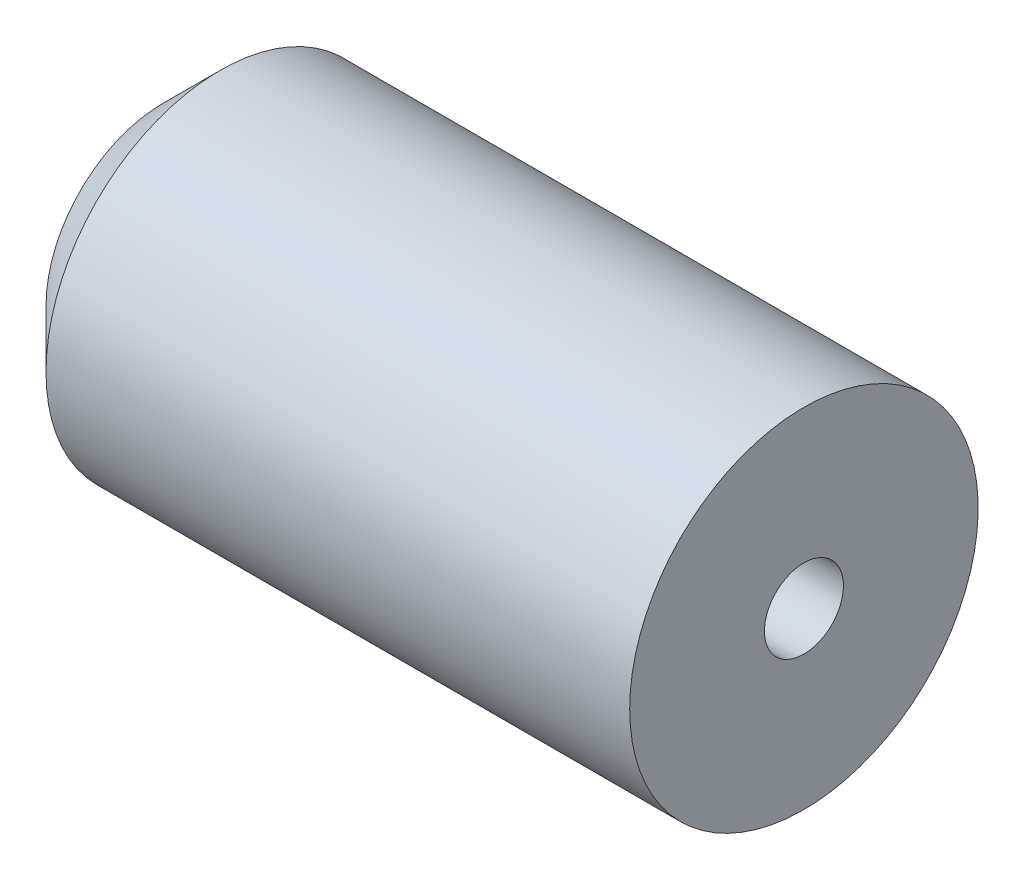
ISO-10303-21;
HEADER;
FILE_DESCRIPTION(('STEP AP214'),'2;1');
FILE_NAME('part.step','',(''),(''),'','','');
FILE_SCHEMA(('AUTOMOTIVE_DESIGN { 1 0 10303 214 1 1 1 1 }'));
ENDSEC;
DATA;
#1=APPLICATION_CONTEXT('core data for automotive mechanical design processes');
#2=APPLICATION_PROTOCOL_DEFINITION('international standard','automotive_design',2000,#1);
#3=PRODUCT_CONTEXT('',#1,'mechanical');
#4=PRODUCT('Part','Part','',(#3));
#5=PRODUCT_RELATED_PRODUCT_CATEGORY('part','',(#4));
#6=PRODUCT_DEFINITION_FORMATION('','',#4);
#7=PRODUCT_DEFINITION_CONTEXT('part definition',#1,'design');
#8=PRODUCT_DEFINITION('design','',#6,#7);
#9=PRODUCT_DEFINITION_SHAPE('','',#8);
#10=(LENGTH_UNIT() NAMED_UNIT(*) SI_UNIT(.MILLI.,.METRE.));
#11=(NAMED_UNIT(*) PLANE_ANGLE_UNIT() SI_UNIT($,.RADIAN.));
#12=(NAMED_UNIT(*) SI_UNIT($,.STERADIAN.) SOLID_ANGLE_UNIT());
#13=UNCERTAINTY_MEASURE_WITH_UNIT(LENGTH_MEASURE(1.E-05),#10,'distance_accuracy_value','');
#14=(GEOMETRIC_REPRESENTATION_CONTEXT(3) GLOBAL_UNCERTAINTY_ASSIGNED_CONTEXT((#13)) GLOBAL_UNIT_ASSIGNED_CONTEXT((#10,
#11,#12)) REPRESENTATION_CONTEXT('',''));
#15=CARTESIAN_POINT('',(0.,0.,0.));
#16=DIRECTION('',(0.,0.,1.));
#17=DIRECTION('',(1.,0.,0.));
#18=AXIS2_PLACEMENT_3D('',#15,#16,#17);
#19=CARTESIAN_POINT('',(0.,0.,0.));
#20=DIRECTION('',(-1.,0.,0.));
#21=DIRECTION('',(0.,0.,1.));
#22=AXIS2_PLACEMENT_3D('',#19,#20,#21);
#23=PLANE('',#22);
#24=CARTESIAN_POINT('',(0.,0.,0.));
#25=DIRECTION('',(-1.,0.,0.));
#26=DIRECTION('',(0.,0.,1.));
#27=AXIS2_PLACEMENT_3D('',#24,#25,#26);
#28=CIRCLE('',#27,9.39999999999998);
#29=CARTESIAN_POINT('',(0.,0.,9.39999999999998));
#30=VERTEX_POINT('',#29);
#31=EDGE_CURVE('E12',#30,#30,#28,.T.);
#32=ORIENTED_EDGE('',*,*,#31,.T.);
#33=EDGE_LOOP('',(#32));
#34=FACE_BOUND('',#33,.T.);
#35=CARTESIAN_POINT('',(0.,0.,0.));
#36=DIRECTION('',(-1.,0.,0.));
#37=DIRECTION('',(0.,0.,1.));
#38=AXIS2_PLACEMENT_3D('',#35,#36,#37);
#39=CIRCLE('',#38,3.175);
#40=CARTESIAN_POINT('',(0.,0.,3.175));
#41=VERTEX_POINT('',#40);
#42=EDGE_CURVE('E66',#41,#41,#39,.T.);
#43=ORIENTED_EDGE('',*,*,#42,.F.);
#44=EDGE_LOOP('',(#43));
#45=FACE_BOUND('',#44,.T.);
#46=ADVANCED_FACE('F19',(#34,#45),#23,.T.);
#47=CARTESIAN_POINT('',(0.,0.,0.));
#48=DIRECTION('',(-1.,0.,0.));
#49=DIRECTION('',(0.,0.,1.));
#50=AXIS2_PLACEMENT_3D('',#47,#48,#49);
#51=CYLINDRICAL_SURFACE('',#50,14.);
#52=CARTESIAN_POINT('',(4.60000000000002,0.,0.));
#53=DIRECTION('',(1.,0.,0.));
#54=DIRECTION('',(0.,0.,1.));
#55=AXIS2_PLACEMENT_3D('',#52,#53,#54);
#56=CIRCLE('',#55,14.);
#57=CARTESIAN_POINT('',(4.60000000000002,0.,14.));
#58=VERTEX_POINT('',#57);
#59=EDGE_CURVE('E31',#58,#58,#56,.T.);
#60=ORIENTED_EDGE('',*,*,#59,.T.);
#61=EDGE_LOOP('',(#60));
#62=FACE_BOUND('',#61,.T.);
#63=CARTESIAN_POINT('',(30.5,0.,0.));
#64=DIRECTION('',(-1.,0.,0.));
#65=DIRECTION('',(0.,1.,0.));
#66=AXIS2_PLACEMENT_3D('',#63,#64,#65);
#67=CIRCLE('',#66,14.);
#68=CARTESIAN_POINT('',(30.5,7.98435971133566,-11.5));
#69=VERTEX_POINT('',#68);
#70=CARTESIAN_POINT('',(30.5,-7.98435971133566,-11.5));
#71=VERTEX_POINT('',#70);
#72=EDGE_CURVE('E62',#69,#71,#67,.T.);
#73=ORIENTED_EDGE('',*,*,#72,.F.);
#74=DIRECTION('',(1.,0.,0.));
#75=VECTOR('',#74,1.);
#76=CARTESIAN_POINT('',(30.5,7.98435971133566,-11.5));
#77=LINE('',#76,#75);
#78=CARTESIAN_POINT('',(7.5,7.98435971133566,-11.5));
#79=VERTEX_POINT('',#78);
#80=EDGE_CURVE('E40',#79,#69,#77,.T.);
#81=ORIENTED_EDGE('',*,*,#80,.F.);
#82=CARTESIAN_POINT('',(7.50000000000001,0.,0.));
#83=DIRECTION('',(1.,0.,0.));
#84=DIRECTION('',(0.,1.,0.));
#85=AXIS2_PLACEMENT_3D('',#82,#83,#84);
#86=CIRCLE('',#85,14.);
#87=CARTESIAN_POINT('',(7.5,-7.98435971133566,-11.5));
#88=VERTEX_POINT('',#87);
#89=EDGE_CURVE('E57',#88,#79,#86,.T.);
#90=ORIENTED_EDGE('',*,*,#89,.F.);
#91=DIRECTION('',(-1.,0.,0.));
#92=VECTOR('',#91,1.);
#93=CARTESIAN_POINT('',(30.5,-7.98435971133566,-11.5));
#94=LINE('',#93,#92);
#95=EDGE_CURVE('E48',#71,#88,#94,.T.);
#96=ORIENTED_EDGE('',*,*,#95,.F.);
#97=EDGE_LOOP('',(#73,#81,#90,#96));
#98=FACE_BOUND('',#97,.T.);
#99=CARTESIAN_POINT('',(51.5,0.,0.));
#100=DIRECTION('',(-1.,0.,0.));
#101=DIRECTION('',(0.,0.,1.));
#102=AXIS2_PLACEMENT_3D('',#99,#100,#101);
#103=CIRCLE('',#102,14.);
#104=CARTESIAN_POINT('',(51.5,0.,14.));
#105=VERTEX_POINT('',#104);
#106=EDGE_CURVE('E61',#105,#105,#103,.T.);
#107=ORIENTED_EDGE('',*,*,#106,.T.);
#108=EDGE_LOOP('',(#107));
#109=FACE_BOUND('',#108,.T.);
#110=ADVANCED_FACE('F21',(#62,#98,#109),#51,.T.);
#111=CARTESIAN_POINT('',(51.5,0.,0.));
#112=DIRECTION('',(1.,0.,0.));
#113=DIRECTION('',(0.,0.,-1.));
#114=AXIS2_PLACEMENT_3D('',#111,#112,#113);
#115=PLANE('',#114);
#116=ORIENTED_EDGE('',*,*,#106,.F.);
#117=EDGE_LOOP('',(#116));
#118=FACE_BOUND('',#117,.T.);
#119=CARTESIAN_POINT('',(51.5,0.,0.));
#120=DIRECTION('',(1.,0.,0.));
#121=DIRECTION('',(0.,1.,0.));
#122=AXIS2_PLACEMENT_3D('',#119,#120,#121);
#123=CIRCLE('',#122,3.175);
#124=CARTESIAN_POINT('',(51.5,3.175,0.));
#125=VERTEX_POINT('',#124);
#126=EDGE_CURVE('E71',#125,#125,#123,.T.);
#127=ORIENTED_EDGE('',*,*,#126,.F.);
#128=EDGE_LOOP('',(#127));
#129=FACE_BOUND('',#128,.T.);
#130=ADVANCED_FACE('F148',(#118,#129),#115,.T.);
#131=CARTESIAN_POINT('',(7.5,-10.,-14.));
#132=DIRECTION('',(-1.,0.,0.));
#133=DIRECTION('',(0.,0.,1.));
#134=AXIS2_PLACEMENT_3D('',#131,#132,#133);
#135=PLANE('',#134);
#136=DIRECTION('',(0.,1.,0.));
#137=VECTOR('',#136,1.);
#138=CARTESIAN_POINT('',(7.5,-7.98435971133566,-11.5));
#139=LINE('',#138,#137);
#140=EDGE_CURVE('E52',#88,#79,#139,.T.);
#141=ORIENTED_EDGE('',*,*,#140,.F.);
#142=ORIENTED_EDGE('',*,*,#89,.T.);
#143=EDGE_LOOP('',(#141,#142));
#144=FACE_BOUND('',#143,.T.);
#145=ADVANCED_FACE('F64',(#144),#135,.F.);
#146=CARTESIAN_POINT('',(30.5,-10.,-14.));
#147=DIRECTION('',(1.,0.,0.));
#148=DIRECTION('',(0.,0.,-1.));
#149=AXIS2_PLACEMENT_3D('',#146,#147,#148);
#150=PLANE('',#149);
#151=ORIENTED_EDGE('',*,*,#72,.T.);
#152=DIRECTION('',(0.,1.,0.));
#153=VECTOR('',#152,1.);
#154=CARTESIAN_POINT('',(30.5,-7.98435971133566,-11.5));
#155=LINE('',#154,#153);
#156=EDGE_CURVE('E23',#71,#69,#155,.T.);
#157=ORIENTED_EDGE('',*,*,#156,.T.);
#158=EDGE_LOOP('',(#151,#157));
#159=FACE_BOUND('',#158,.T.);
#160=ADVANCED_FACE('F139',(#159),#150,.F.);
#161=CARTESIAN_POINT('',(7.5,-10.,-11.5));
#162=DIRECTION('',(0.,0.,1.));
#163=DIRECTION('',(1.,0.,0.));
#164=AXIS2_PLACEMENT_3D('',#161,#162,#163);
#165=PLANE('',#164);
#166=ORIENTED_EDGE('',*,*,#80,.T.);
#167=ORIENTED_EDGE('',*,*,#156,.F.);
#168=ORIENTED_EDGE('',*,*,#95,.T.);
#169=ORIENTED_EDGE('',*,*,#140,.T.);
#170=EDGE_LOOP('',(#166,#167,#168,#169));
#171=FACE_BOUND('',#170,.T.);
#172=ADVANCED_FACE('F50',(#171),#165,.F.);
#173=CARTESIAN_POINT('',(-28.5,0.,0.));
#174=DIRECTION('',(1.,0.,0.));
#175=DIRECTION('',(0.,1.,0.));
#176=AXIS2_PLACEMENT_3D('',#173,#174,#175);
#177=CYLINDRICAL_SURFACE('',#176,3.175);
#178=ORIENTED_EDGE('',*,*,#42,.T.);
#179=EDGE_LOOP('',(#178));
#180=FACE_BOUND('',#179,.T.);
#181=ORIENTED_EDGE('',*,*,#126,.T.);
#182=EDGE_LOOP('',(#181));
#183=FACE_BOUND('',#182,.T.);
#184=ADVANCED_FACE('F110',(#180,#183),#177,.F.);
#185=CARTESIAN_POINT('',(0.,0.,0.));
#186=DIRECTION('',(1.,0.,0.));
#187=DIRECTION('',(0.,1.,0.));
#188=AXIS2_PLACEMENT_3D('',#185,#186,#187);
#189=CONICAL_SURFACE('',#188,9.39999999999998,0.785398163397448);
#190=ORIENTED_EDGE('',*,*,#59,.F.);
#191=EDGE_LOOP('',(#190));
#192=FACE_BOUND('',#191,.T.);
#193=ORIENTED_EDGE('',*,*,#31,.F.);
#194=EDGE_LOOP('',(#193));
#195=FACE_BOUND('',#194,.T.);
#196=ADVANCED_FACE('F107',(#192,#195),#189,.T.);
#197=CLOSED_SHELL('',(#46,#110,#130,#145,#160,#172,#184,#196));
#198=MANIFOLD_SOLID_BREP('B1',#197);
#199=ADVANCED_BREP_SHAPE_REPRESENTATION('',(#18,#198),#14);
#200=SHAPE_DEFINITION_REPRESENTATION(#9,#199);
ENDSEC;
END-ISO-10303-21;
